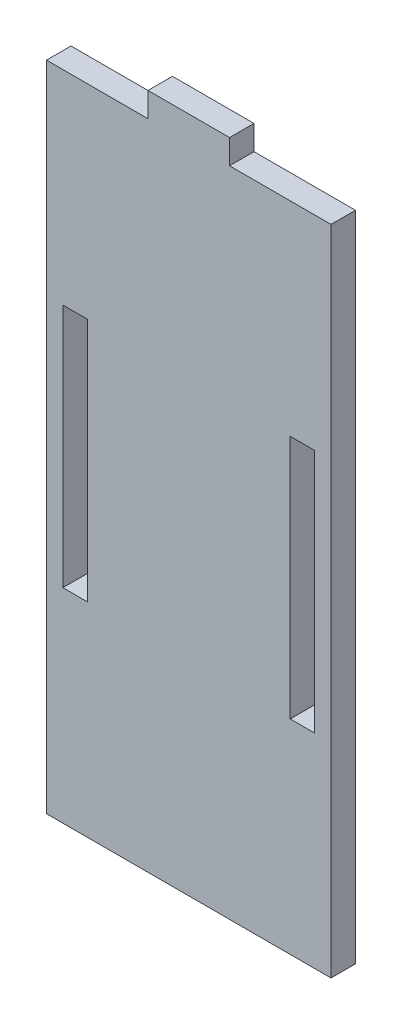
ISO-10303-21;
HEADER;
FILE_DESCRIPTION(('STEP AP214'),'2;1');
FILE_NAME('part.step','',(''),(''),'','','');
FILE_SCHEMA(('AUTOMOTIVE_DESIGN { 1 0 10303 214 1 1 1 1 }'));
ENDSEC;
DATA;
#1=APPLICATION_CONTEXT('core data for automotive mechanical design processes');
#2=APPLICATION_PROTOCOL_DEFINITION('international standard','automotive_design',2000,#1);
#3=PRODUCT_CONTEXT('',#1,'mechanical');
#4=PRODUCT('Part','Part','',(#3));
#5=PRODUCT_RELATED_PRODUCT_CATEGORY('part','',(#4));
#6=PRODUCT_DEFINITION_FORMATION('','',#4);
#7=PRODUCT_DEFINITION_CONTEXT('part definition',#1,'design');
#8=PRODUCT_DEFINITION('design','',#6,#7);
#9=PRODUCT_DEFINITION_SHAPE('','',#8);
#10=(LENGTH_UNIT() NAMED_UNIT(*) SI_UNIT(.MILLI.,.METRE.));
#11=(NAMED_UNIT(*) PLANE_ANGLE_UNIT() SI_UNIT($,.RADIAN.));
#12=(NAMED_UNIT(*) SI_UNIT($,.STERADIAN.) SOLID_ANGLE_UNIT());
#13=UNCERTAINTY_MEASURE_WITH_UNIT(LENGTH_MEASURE(1.E-05),#10,'distance_accuracy_value','');
#14=(GEOMETRIC_REPRESENTATION_CONTEXT(3) GLOBAL_UNCERTAINTY_ASSIGNED_CONTEXT((#13)) GLOBAL_UNIT_ASSIGNED_CONTEXT((#10,
#11,#12)) REPRESENTATION_CONTEXT('',''));
#15=CARTESIAN_POINT('',(0.,0.,0.));
#16=DIRECTION('',(0.,0.,1.));
#17=DIRECTION('',(1.,0.,0.));
#18=AXIS2_PLACEMENT_3D('',#15,#16,#17);
#19=CARTESIAN_POINT('',(0.,-25.,3.));
#20=DIRECTION('',(0.,1.,0.));
#21=DIRECTION('',(0.,0.,1.));
#22=AXIS2_PLACEMENT_3D('',#19,#20,#21);
#23=PLANE('',#22);
#24=DIRECTION('',(1.,0.,0.));
#25=VECTOR('',#24,1.);
#26=CARTESIAN_POINT('',(0.,-25.,0.));
#27=LINE('',#26,#25);
#28=CARTESIAN_POINT('',(2.,-25.,0.));
#29=VERTEX_POINT('',#28);
#30=CARTESIAN_POINT('',(5.,-25.,0.));
#31=VERTEX_POINT('',#30);
#32=EDGE_CURVE('E243',#29,#31,#27,.T.);
#33=ORIENTED_EDGE('',*,*,#32,.T.);
#34=DIRECTION('',(0.,0.,-1.));
#35=VECTOR('',#34,1.);
#36=CARTESIAN_POINT('',(5.,-25.,3.));
#37=LINE('',#36,#35);
#38=CARTESIAN_POINT('',(5.,-25.,3.));
#39=VERTEX_POINT('',#38);
#40=EDGE_CURVE('E11',#39,#31,#37,.T.);
#41=ORIENTED_EDGE('',*,*,#40,.F.);
#42=DIRECTION('',(1.,0.,0.));
#43=VECTOR('',#42,1.);
#44=CARTESIAN_POINT('',(0.,-25.,3.));
#45=LINE('',#44,#43);
#46=CARTESIAN_POINT('',(2.,-25.,3.));
#47=VERTEX_POINT('',#46);
#48=EDGE_CURVE('E176',#47,#39,#45,.T.);
#49=ORIENTED_EDGE('',*,*,#48,.F.);
#50=DIRECTION('',(0.,0.,-1.));
#51=VECTOR('',#50,1.);
#52=CARTESIAN_POINT('',(2.,-25.,3.));
#53=LINE('',#52,#51);
#54=EDGE_CURVE('E67',#47,#29,#53,.T.);
#55=ORIENTED_EDGE('',*,*,#54,.T.);
#56=EDGE_LOOP('',(#33,#41,#49,#55));
#57=FACE_BOUND('',#56,.T.);
#58=ADVANCED_FACE('F47',(#57),#23,.F.);
#59=CARTESIAN_POINT('',(5.,0.,3.));
#60=DIRECTION('',(1.,0.,0.));
#61=DIRECTION('',(0.,1.,0.));
#62=AXIS2_PLACEMENT_3D('',#59,#60,#61);
#63=PLANE('',#62);
#64=DIRECTION('',(0.,-1.,0.));
#65=VECTOR('',#64,1.);
#66=CARTESIAN_POINT('',(5.,0.,0.));
#67=LINE('',#66,#65);
#68=CARTESIAN_POINT('',(5.00000000000001,-55.,0.));
#69=VERTEX_POINT('',#68);
#70=EDGE_CURVE('E183',#31,#69,#67,.T.);
#71=ORIENTED_EDGE('',*,*,#70,.T.);
#72=DIRECTION('',(0.,0.,-1.));
#73=VECTOR('',#72,1.);
#74=CARTESIAN_POINT('',(5.00000000000001,-55.,3.));
#75=LINE('',#74,#73);
#76=CARTESIAN_POINT('',(5.00000000000001,-55.,3.));
#77=VERTEX_POINT('',#76);
#78=EDGE_CURVE('E58',#77,#69,#75,.T.);
#79=ORIENTED_EDGE('',*,*,#78,.F.);
#80=DIRECTION('',(0.,-1.,0.));
#81=VECTOR('',#80,1.);
#82=CARTESIAN_POINT('',(5.,0.,3.));
#83=LINE('',#82,#81);
#84=EDGE_CURVE('E170',#39,#77,#83,.T.);
#85=ORIENTED_EDGE('',*,*,#84,.F.);
#86=ORIENTED_EDGE('',*,*,#40,.T.);
#87=EDGE_LOOP('',(#71,#79,#85,#86));
#88=FACE_BOUND('',#87,.T.);
#89=ADVANCED_FACE('F182',(#88),#63,.F.);
#90=CARTESIAN_POINT('',(0.,-55.,3.));
#91=DIRECTION('',(0.,1.,0.));
#92=DIRECTION('',(0.,0.,1.));
#93=AXIS2_PLACEMENT_3D('',#90,#91,#92);
#94=PLANE('',#93);
#95=DIRECTION('',(1.,0.,0.));
#96=VECTOR('',#95,1.);
#97=CARTESIAN_POINT('',(0.,-55.,0.));
#98=LINE('',#97,#96);
#99=CARTESIAN_POINT('',(2.00000000000001,-55.,0.));
#100=VERTEX_POINT('',#99);
#101=EDGE_CURVE('E248',#100,#69,#98,.T.);
#102=ORIENTED_EDGE('',*,*,#101,.F.);
#103=DIRECTION('',(0.,0.,-1.));
#104=VECTOR('',#103,1.);
#105=CARTESIAN_POINT('',(2.00000000000001,-55.,3.));
#106=LINE('',#105,#104);
#107=CARTESIAN_POINT('',(2.00000000000001,-55.,3.));
#108=VERTEX_POINT('',#107);
#109=EDGE_CURVE('E117',#108,#100,#106,.T.);
#110=ORIENTED_EDGE('',*,*,#109,.F.);
#111=DIRECTION('',(1.,0.,0.));
#112=VECTOR('',#111,1.);
#113=CARTESIAN_POINT('',(0.,-55.,3.));
#114=LINE('',#113,#112);
#115=EDGE_CURVE('E175',#108,#77,#114,.T.);
#116=ORIENTED_EDGE('',*,*,#115,.T.);
#117=ORIENTED_EDGE('',*,*,#78,.T.);
#118=EDGE_LOOP('',(#102,#110,#116,#117));
#119=FACE_BOUND('',#118,.T.);
#120=ADVANCED_FACE('F188',(#119),#94,.T.);
#121=CARTESIAN_POINT('',(0.,-55.,3.));
#122=DIRECTION('',(0.,-1.,0.));
#123=DIRECTION('',(0.,0.,-1.));
#124=AXIS2_PLACEMENT_3D('',#121,#122,#123);
#125=PLANE('',#124);
#126=DIRECTION('',(-1.,0.,0.));
#127=VECTOR('',#126,1.);
#128=CARTESIAN_POINT('',(0.,-55.,0.));
#129=LINE('',#128,#127);
#130=CARTESIAN_POINT('',(32.87,-55.,0.));
#131=VERTEX_POINT('',#130);
#132=CARTESIAN_POINT('',(29.87,-55.,0.));
#133=VERTEX_POINT('',#132);
#134=EDGE_CURVE('E228',#131,#133,#129,.T.);
#135=ORIENTED_EDGE('',*,*,#134,.T.);
#136=DIRECTION('',(0.,0.,-1.));
#137=VECTOR('',#136,1.);
#138=CARTESIAN_POINT('',(29.87,-55.,3.));
#139=LINE('',#138,#137);
#140=CARTESIAN_POINT('',(29.87,-55.,3.));
#141=VERTEX_POINT('',#140);
#142=EDGE_CURVE('E257',#141,#133,#139,.T.);
#143=ORIENTED_EDGE('',*,*,#142,.F.);
#144=DIRECTION('',(-1.,0.,0.));
#145=VECTOR('',#144,1.);
#146=CARTESIAN_POINT('',(0.,-55.,3.));
#147=LINE('',#146,#145);
#148=CARTESIAN_POINT('',(32.87,-55.,3.));
#149=VERTEX_POINT('',#148);
#150=EDGE_CURVE('E341',#149,#141,#147,.T.);
#151=ORIENTED_EDGE('',*,*,#150,.F.);
#152=DIRECTION('',(0.,0.,-1.));
#153=VECTOR('',#152,1.);
#154=CARTESIAN_POINT('',(32.87,-55.,3.));
#155=LINE('',#154,#153);
#156=EDGE_CURVE('E260',#149,#131,#155,.T.);
#157=ORIENTED_EDGE('',*,*,#156,.T.);
#158=EDGE_LOOP('',(#135,#143,#151,#157));
#159=FACE_BOUND('',#158,.T.);
#160=ADVANCED_FACE('F366',(#159),#125,.F.);
#161=CARTESIAN_POINT('',(29.87,0.,3.));
#162=DIRECTION('',(1.,0.,0.));
#163=DIRECTION('',(0.,0.,-1.));
#164=AXIS2_PLACEMENT_3D('',#161,#162,#163);
#165=PLANE('',#164);
#166=DIRECTION('',(0.,-1.,0.));
#167=VECTOR('',#166,1.);
#168=CARTESIAN_POINT('',(29.87,0.,0.));
#169=LINE('',#168,#167);
#170=CARTESIAN_POINT('',(29.87,-25.,0.));
#171=VERTEX_POINT('',#170);
#172=EDGE_CURVE('E232',#171,#133,#169,.T.);
#173=ORIENTED_EDGE('',*,*,#172,.F.);
#174=DIRECTION('',(0.,0.,-1.));
#175=VECTOR('',#174,1.);
#176=CARTESIAN_POINT('',(29.87,-25.,3.));
#177=LINE('',#176,#175);
#178=CARTESIAN_POINT('',(29.87,-25.,3.));
#179=VERTEX_POINT('',#178);
#180=EDGE_CURVE('E267',#179,#171,#177,.T.);
#181=ORIENTED_EDGE('',*,*,#180,.F.);
#182=DIRECTION('',(0.,-1.,0.));
#183=VECTOR('',#182,1.);
#184=CARTESIAN_POINT('',(29.87,0.,3.));
#185=LINE('',#184,#183);
#186=EDGE_CURVE('E344',#179,#141,#185,.T.);
#187=ORIENTED_EDGE('',*,*,#186,.T.);
#188=ORIENTED_EDGE('',*,*,#142,.T.);
#189=EDGE_LOOP('',(#173,#181,#187,#188));
#190=FACE_BOUND('',#189,.T.);
#191=ADVANCED_FACE('F369',(#190),#165,.T.);
#192=CARTESIAN_POINT('',(0.,-25.,3.));
#193=DIRECTION('',(0.,-1.,0.));
#194=DIRECTION('',(0.,0.,-1.));
#195=AXIS2_PLACEMENT_3D('',#192,#193,#194);
#196=PLANE('',#195);
#197=DIRECTION('',(-1.,0.,0.));
#198=VECTOR('',#197,1.);
#199=CARTESIAN_POINT('',(0.,-25.,0.));
#200=LINE('',#199,#198);
#201=CARTESIAN_POINT('',(32.87,-25.,0.));
#202=VERTEX_POINT('',#201);
#203=EDGE_CURVE('E236',#202,#171,#200,.T.);
#204=ORIENTED_EDGE('',*,*,#203,.F.);
#205=DIRECTION('',(0.,0.,-1.));
#206=VECTOR('',#205,1.);
#207=CARTESIAN_POINT('',(32.87,-25.,3.));
#208=LINE('',#207,#206);
#209=CARTESIAN_POINT('',(32.87,-25.,3.));
#210=VERTEX_POINT('',#209);
#211=EDGE_CURVE('E264',#210,#202,#208,.T.);
#212=ORIENTED_EDGE('',*,*,#211,.F.);
#213=DIRECTION('',(-1.,0.,0.));
#214=VECTOR('',#213,1.);
#215=CARTESIAN_POINT('',(0.,-25.,3.));
#216=LINE('',#215,#214);
#217=EDGE_CURVE('E348',#210,#179,#216,.T.);
#218=ORIENTED_EDGE('',*,*,#217,.T.);
#219=ORIENTED_EDGE('',*,*,#180,.T.);
#220=EDGE_LOOP('',(#204,#212,#218,#219));
#221=FACE_BOUND('',#220,.T.);
#222=ADVANCED_FACE('F372',(#221),#196,.T.);
#223=CARTESIAN_POINT('',(0.,-80.,3.));
#224=DIRECTION('',(0.,1.,0.));
#225=DIRECTION('',(0.,0.,1.));
#226=AXIS2_PLACEMENT_3D('',#223,#224,#225);
#227=PLANE('',#226);
#228=DIRECTION('',(1.,0.,0.));
#229=VECTOR('',#228,1.);
#230=CARTESIAN_POINT('',(0.,-80.,0.));
#231=LINE('',#230,#229);
#232=CARTESIAN_POINT('',(0.,-80.,0.));
#233=VERTEX_POINT('',#232);
#234=CARTESIAN_POINT('',(34.87,-80.,0.));
#235=VERTEX_POINT('',#234);
#236=EDGE_CURVE('E197',#233,#235,#231,.T.);
#237=ORIENTED_EDGE('',*,*,#236,.T.);
#238=DIRECTION('',(0.,0.,-1.));
#239=VECTOR('',#238,1.);
#240=CARTESIAN_POINT('',(34.87,-80.,3.));
#241=LINE('',#240,#239);
#242=CARTESIAN_POINT('',(34.87,-80.,3.));
#243=VERTEX_POINT('',#242);
#244=EDGE_CURVE('E51',#243,#235,#241,.T.);
#245=ORIENTED_EDGE('',*,*,#244,.F.);
#246=DIRECTION('',(1.,0.,0.));
#247=VECTOR('',#246,1.);
#248=CARTESIAN_POINT('',(0.,-80.,3.));
#249=LINE('',#248,#247);
#250=CARTESIAN_POINT('',(0.,-80.,3.));
#251=VERTEX_POINT('',#250);
#252=EDGE_CURVE('E130',#251,#243,#249,.T.);
#253=ORIENTED_EDGE('',*,*,#252,.F.);
#254=DIRECTION('',(0.,0.,-1.));
#255=VECTOR('',#254,1.);
#256=CARTESIAN_POINT('',(0.,-80.,3.));
#257=LINE('',#256,#255);
#258=EDGE_CURVE('E193',#251,#233,#257,.T.);
#259=ORIENTED_EDGE('',*,*,#258,.T.);
#260=EDGE_LOOP('',(#237,#245,#253,#259));
#261=FACE_BOUND('',#260,.T.);
#262=ADVANCED_FACE('F49',(#261),#227,.F.);
#263=CARTESIAN_POINT('',(34.87,0.,3.));
#264=DIRECTION('',(1.,0.,0.));
#265=DIRECTION('',(0.,0.,-1.));
#266=AXIS2_PLACEMENT_3D('',#263,#264,#265);
#267=PLANE('',#266);
#268=DIRECTION('',(0.,-1.,0.));
#269=VECTOR('',#268,1.);
#270=CARTESIAN_POINT('',(34.87,0.,0.));
#271=LINE('',#270,#269);
#272=CARTESIAN_POINT('',(34.87,0.,0.));
#273=VERTEX_POINT('',#272);
#274=EDGE_CURVE('E201',#273,#235,#271,.T.);
#275=ORIENTED_EDGE('',*,*,#274,.F.);
#276=DIRECTION('',(0.,0.,-1.));
#277=VECTOR('',#276,1.);
#278=CARTESIAN_POINT('',(34.87,0.,3.));
#279=LINE('',#278,#277);
#280=CARTESIAN_POINT('',(34.87,0.,3.));
#281=VERTEX_POINT('',#280);
#282=EDGE_CURVE('E289',#281,#273,#279,.T.);
#283=ORIENTED_EDGE('',*,*,#282,.F.);
#284=DIRECTION('',(0.,-1.,0.));
#285=VECTOR('',#284,1.);
#286=CARTESIAN_POINT('',(34.87,0.,3.));
#287=LINE('',#286,#285);
#288=EDGE_CURVE('E299',#281,#243,#287,.T.);
#289=ORIENTED_EDGE('',*,*,#288,.T.);
#290=ORIENTED_EDGE('',*,*,#244,.T.);
#291=EDGE_LOOP('',(#275,#283,#289,#290));
#292=FACE_BOUND('',#291,.T.);
#293=ADVANCED_FACE('F298',(#292),#267,.T.);
#294=CARTESIAN_POINT('',(0.,0.,3.));
#295=DIRECTION('',(0.,1.,0.));
#296=DIRECTION('',(-1.,0.,0.));
#297=AXIS2_PLACEMENT_3D('',#294,#295,#296);
#298=PLANE('',#297);
#299=DIRECTION('',(1.,0.,0.));
#300=VECTOR('',#299,1.);
#301=CARTESIAN_POINT('',(0.,0.,0.));
#302=LINE('',#301,#300);
#303=CARTESIAN_POINT('',(22.435,0.,0.));
#304=VERTEX_POINT('',#303);
#305=EDGE_CURVE('E205',#304,#273,#302,.T.);
#306=ORIENTED_EDGE('',*,*,#305,.F.);
#307=DIRECTION('',(0.,0.,-1.));
#308=VECTOR('',#307,1.);
#309=CARTESIAN_POINT('',(22.435,0.,3.));
#310=LINE('',#309,#308);
#311=CARTESIAN_POINT('',(22.435,0.,3.));
#312=VERTEX_POINT('',#311);
#313=EDGE_CURVE('E287',#312,#304,#310,.T.);
#314=ORIENTED_EDGE('',*,*,#313,.F.);
#315=DIRECTION('',(1.,0.,0.));
#316=VECTOR('',#315,1.);
#317=CARTESIAN_POINT('',(0.,0.,3.));
#318=LINE('',#317,#316);
#319=EDGE_CURVE('E311',#312,#281,#318,.T.);
#320=ORIENTED_EDGE('',*,*,#319,.T.);
#321=ORIENTED_EDGE('',*,*,#282,.T.);
#322=EDGE_LOOP('',(#306,#314,#320,#321));
#323=FACE_BOUND('',#322,.T.);
#324=ADVANCED_FACE('F308',(#323),#298,.T.);
#325=CARTESIAN_POINT('',(22.435,0.,3.));
#326=DIRECTION('',(-1.,0.,0.));
#327=DIRECTION('',(0.,0.,1.));
#328=AXIS2_PLACEMENT_3D('',#325,#326,#327);
#329=PLANE('',#328);
#330=DIRECTION('',(0.,1.,0.));
#331=VECTOR('',#330,1.);
#332=CARTESIAN_POINT('',(22.435,0.,0.));
#333=LINE('',#332,#331);
#334=CARTESIAN_POINT('',(22.435,3.,0.));
#335=VERTEX_POINT('',#334);
#336=EDGE_CURVE('E209',#304,#335,#333,.T.);
#337=ORIENTED_EDGE('',*,*,#336,.T.);
#338=DIRECTION('',(0.,0.,-1.));
#339=VECTOR('',#338,1.);
#340=CARTESIAN_POINT('',(22.435,3.,3.));
#341=LINE('',#340,#339);
#342=CARTESIAN_POINT('',(22.435,3.,3.));
#343=VERTEX_POINT('',#342);
#344=EDGE_CURVE('E284',#343,#335,#341,.T.);
#345=ORIENTED_EDGE('',*,*,#344,.F.);
#346=DIRECTION('',(0.,1.,0.));
#347=VECTOR('',#346,1.);
#348=CARTESIAN_POINT('',(22.435,0.,3.));
#349=LINE('',#348,#347);
#350=EDGE_CURVE('E314',#312,#343,#349,.T.);
#351=ORIENTED_EDGE('',*,*,#350,.F.);
#352=ORIENTED_EDGE('',*,*,#313,.T.);
#353=EDGE_LOOP('',(#337,#345,#351,#352));
#354=FACE_BOUND('',#353,.T.);
#355=ADVANCED_FACE('F315',(#354),#329,.F.);
#356=CARTESIAN_POINT('',(0.,3.,3.));
#357=DIRECTION('',(0.,1.,0.));
#358=DIRECTION('',(0.,0.,1.));
#359=AXIS2_PLACEMENT_3D('',#356,#357,#358);
#360=PLANE('',#359);
#361=DIRECTION('',(1.,0.,0.));
#362=VECTOR('',#361,1.);
#363=CARTESIAN_POINT('',(0.,3.,0.));
#364=LINE('',#363,#362);
#365=CARTESIAN_POINT('',(12.435,3.,0.));
#366=VERTEX_POINT('',#365);
#367=EDGE_CURVE('E213',#366,#335,#364,.T.);
#368=ORIENTED_EDGE('',*,*,#367,.F.);
#369=DIRECTION('',(0.,0.,-1.));
#370=VECTOR('',#369,1.);
#371=CARTESIAN_POINT('',(12.435,3.,3.));
#372=LINE('',#371,#370);
#373=CARTESIAN_POINT('',(12.435,3.,3.));
#374=VERTEX_POINT('',#373);
#375=EDGE_CURVE('E281',#374,#366,#372,.T.);
#376=ORIENTED_EDGE('',*,*,#375,.F.);
#377=DIRECTION('',(1.,0.,0.));
#378=VECTOR('',#377,1.);
#379=CARTESIAN_POINT('',(0.,3.,3.));
#380=LINE('',#379,#378);
#381=EDGE_CURVE('E319',#374,#343,#380,.T.);
#382=ORIENTED_EDGE('',*,*,#381,.T.);
#383=ORIENTED_EDGE('',*,*,#344,.T.);
#384=EDGE_LOOP('',(#368,#376,#382,#383));
#385=FACE_BOUND('',#384,.T.);
#386=ADVANCED_FACE('F410',(#385),#360,.T.);
#387=CARTESIAN_POINT('',(12.435,0.,3.));
#388=DIRECTION('',(-1.,0.,0.));
#389=DIRECTION('',(0.,-1.,0.));
#390=AXIS2_PLACEMENT_3D('',#387,#388,#389);
#391=PLANE('',#390);
#392=DIRECTION('',(0.,1.,0.));
#393=VECTOR('',#392,1.);
#394=CARTESIAN_POINT('',(12.435,0.,0.));
#395=LINE('',#394,#393);
#396=CARTESIAN_POINT('',(12.435,0.,0.));
#397=VERTEX_POINT('',#396);
#398=EDGE_CURVE('E217',#397,#366,#395,.T.);
#399=ORIENTED_EDGE('',*,*,#398,.F.);
#400=DIRECTION('',(0.,0.,-1.));
#401=VECTOR('',#400,1.);
#402=CARTESIAN_POINT('',(12.435,0.,3.));
#403=LINE('',#402,#401);
#404=CARTESIAN_POINT('',(12.435,0.,3.));
#405=VERTEX_POINT('',#404);
#406=EDGE_CURVE('E278',#405,#397,#403,.T.);
#407=ORIENTED_EDGE('',*,*,#406,.F.);
#408=DIRECTION('',(0.,1.,0.));
#409=VECTOR('',#408,1.);
#410=CARTESIAN_POINT('',(12.435,0.,3.));
#411=LINE('',#410,#409);
#412=EDGE_CURVE('E330',#405,#374,#411,.T.);
#413=ORIENTED_EDGE('',*,*,#412,.T.);
#414=ORIENTED_EDGE('',*,*,#375,.T.);
#415=EDGE_LOOP('',(#399,#407,#413,#414));
#416=FACE_BOUND('',#415,.T.);
#417=ADVANCED_FACE('F406',(#416),#391,.T.);
#418=CARTESIAN_POINT('',(0.,0.,3.));
#419=DIRECTION('',(0.,1.,0.));
#420=DIRECTION('',(-1.,0.,0.));
#421=AXIS2_PLACEMENT_3D('',#418,#419,#420);
#422=PLANE('',#421);
#423=DIRECTION('',(1.,0.,0.));
#424=VECTOR('',#423,1.);
#425=CARTESIAN_POINT('',(0.,0.,0.));
#426=LINE('',#425,#424);
#427=CARTESIAN_POINT('',(0.,0.,0.));
#428=VERTEX_POINT('',#427);
#429=EDGE_CURVE('E221',#428,#397,#426,.T.);
#430=ORIENTED_EDGE('',*,*,#429,.F.);
#431=DIRECTION('',(0.,0.,-1.));
#432=VECTOR('',#431,1.);
#433=CARTESIAN_POINT('',(0.,0.,3.));
#434=LINE('',#433,#432);
#435=CARTESIAN_POINT('',(0.,0.,3.));
#436=VERTEX_POINT('',#435);
#437=EDGE_CURVE('E275',#436,#428,#434,.T.);
#438=ORIENTED_EDGE('',*,*,#437,.F.);
#439=DIRECTION('',(1.,0.,0.));
#440=VECTOR('',#439,1.);
#441=CARTESIAN_POINT('',(0.,0.,3.));
#442=LINE('',#441,#440);
#443=EDGE_CURVE('E334',#436,#405,#442,.T.);
#444=ORIENTED_EDGE('',*,*,#443,.T.);
#445=ORIENTED_EDGE('',*,*,#406,.T.);
#446=EDGE_LOOP('',(#430,#438,#444,#445));
#447=FACE_BOUND('',#446,.T.);
#448=ADVANCED_FACE('F397',(#447),#422,.T.);
#449=CARTESIAN_POINT('',(32.87,0.,3.));
#450=DIRECTION('',(1.,0.,0.));
#451=DIRECTION('',(0.,1.,0.));
#452=AXIS2_PLACEMENT_3D('',#449,#450,#451);
#453=PLANE('',#452);
#454=DIRECTION('',(0.,-1.,0.));
#455=VECTOR('',#454,1.);
#456=CARTESIAN_POINT('',(32.87,0.,0.));
#457=LINE('',#456,#455);
#458=EDGE_CURVE('E240',#202,#131,#457,.T.);
#459=ORIENTED_EDGE('',*,*,#458,.T.);
#460=ORIENTED_EDGE('',*,*,#156,.F.);
#461=DIRECTION('',(0.,-1.,0.));
#462=VECTOR('',#461,1.);
#463=CARTESIAN_POINT('',(32.87,0.,3.));
#464=LINE('',#463,#462);
#465=EDGE_CURVE('E352',#210,#149,#464,.T.);
#466=ORIENTED_EDGE('',*,*,#465,.F.);
#467=ORIENTED_EDGE('',*,*,#211,.T.);
#468=EDGE_LOOP('',(#459,#460,#466,#467));
#469=FACE_BOUND('',#468,.T.);
#470=ADVANCED_FACE('F362',(#469),#453,.F.);
#471=CARTESIAN_POINT('',(0.,0.,3.));
#472=DIRECTION('',(1.,0.,0.));
#473=DIRECTION('',(0.,1.,0.));
#474=AXIS2_PLACEMENT_3D('',#471,#472,#473);
#475=PLANE('',#474);
#476=DIRECTION('',(0.,-1.,0.));
#477=VECTOR('',#476,1.);
#478=CARTESIAN_POINT('',(0.,0.,0.));
#479=LINE('',#478,#477);
#480=EDGE_CURVE('E225',#428,#233,#479,.T.);
#481=ORIENTED_EDGE('',*,*,#480,.T.);
#482=ORIENTED_EDGE('',*,*,#258,.F.);
#483=DIRECTION('',(0.,-1.,0.));
#484=VECTOR('',#483,1.);
#485=CARTESIAN_POINT('',(0.,0.,3.));
#486=LINE('',#485,#484);
#487=EDGE_CURVE('E338',#436,#251,#486,.T.);
#488=ORIENTED_EDGE('',*,*,#487,.F.);
#489=ORIENTED_EDGE('',*,*,#437,.T.);
#490=EDGE_LOOP('',(#481,#482,#488,#489));
#491=FACE_BOUND('',#490,.T.);
#492=ADVANCED_FACE('F378',(#491),#475,.F.);
#493=CARTESIAN_POINT('',(2.,0.,3.));
#494=DIRECTION('',(1.,0.,0.));
#495=DIRECTION('',(0.,1.,0.));
#496=AXIS2_PLACEMENT_3D('',#493,#494,#495);
#497=PLANE('',#496);
#498=DIRECTION('',(0.,-1.,0.));
#499=VECTOR('',#498,1.);
#500=CARTESIAN_POINT('',(2.,0.,0.));
#501=LINE('',#500,#499);
#502=EDGE_CURVE('E251',#29,#100,#501,.T.);
#503=ORIENTED_EDGE('',*,*,#502,.F.);
#504=ORIENTED_EDGE('',*,*,#54,.F.);
#505=DIRECTION('',(0.,-1.,0.));
#506=VECTOR('',#505,1.);
#507=CARTESIAN_POINT('',(2.,0.,3.));
#508=LINE('',#507,#506);
#509=EDGE_CURVE('E190',#47,#108,#508,.T.);
#510=ORIENTED_EDGE('',*,*,#509,.T.);
#511=ORIENTED_EDGE('',*,*,#109,.T.);
#512=EDGE_LOOP('',(#503,#504,#510,#511));
#513=FACE_BOUND('',#512,.T.);
#514=ADVANCED_FACE('F376',(#513),#497,.T.);
#515=CARTESIAN_POINT('',(0.,0.,3.));
#516=DIRECTION('',(0.,0.,1.));
#517=DIRECTION('',(1.,0.,0.));
#518=AXIS2_PLACEMENT_3D('',#515,#516,#517);
#519=PLANE('',#518);
#520=ORIENTED_EDGE('',*,*,#252,.T.);
#521=ORIENTED_EDGE('',*,*,#288,.F.);
#522=ORIENTED_EDGE('',*,*,#319,.F.);
#523=ORIENTED_EDGE('',*,*,#350,.T.);
#524=ORIENTED_EDGE('',*,*,#381,.F.);
#525=ORIENTED_EDGE('',*,*,#412,.F.);
#526=ORIENTED_EDGE('',*,*,#443,.F.);
#527=ORIENTED_EDGE('',*,*,#487,.T.);
#528=EDGE_LOOP('',(#520,#521,#522,#523,#524,#525,#526,#527));
#529=FACE_BOUND('',#528,.T.);
#530=ORIENTED_EDGE('',*,*,#150,.T.);
#531=ORIENTED_EDGE('',*,*,#186,.F.);
#532=ORIENTED_EDGE('',*,*,#217,.F.);
#533=ORIENTED_EDGE('',*,*,#465,.T.);
#534=EDGE_LOOP('',(#530,#531,#532,#533));
#535=FACE_BOUND('',#534,.T.);
#536=ORIENTED_EDGE('',*,*,#48,.T.);
#537=ORIENTED_EDGE('',*,*,#84,.T.);
#538=ORIENTED_EDGE('',*,*,#115,.F.);
#539=ORIENTED_EDGE('',*,*,#509,.F.);
#540=EDGE_LOOP('',(#536,#537,#538,#539));
#541=FACE_BOUND('',#540,.T.);
#542=ADVANCED_FACE('F172',(#529,#535,#541),#519,.T.);
#543=CARTESIAN_POINT('',(0.,0.,0.));
#544=DIRECTION('',(0.,0.,1.));
#545=DIRECTION('',(1.,0.,0.));
#546=AXIS2_PLACEMENT_3D('',#543,#544,#545);
#547=PLANE('',#546);
#548=ORIENTED_EDGE('',*,*,#236,.F.);
#549=ORIENTED_EDGE('',*,*,#480,.F.);
#550=ORIENTED_EDGE('',*,*,#429,.T.);
#551=ORIENTED_EDGE('',*,*,#398,.T.);
#552=ORIENTED_EDGE('',*,*,#367,.T.);
#553=ORIENTED_EDGE('',*,*,#336,.F.);
#554=ORIENTED_EDGE('',*,*,#305,.T.);
#555=ORIENTED_EDGE('',*,*,#274,.T.);
#556=EDGE_LOOP('',(#548,#549,#550,#551,#552,#553,#554,#555));
#557=FACE_BOUND('',#556,.T.);
#558=ORIENTED_EDGE('',*,*,#134,.F.);
#559=ORIENTED_EDGE('',*,*,#458,.F.);
#560=ORIENTED_EDGE('',*,*,#203,.T.);
#561=ORIENTED_EDGE('',*,*,#172,.T.);
#562=EDGE_LOOP('',(#558,#559,#560,#561));
#563=FACE_BOUND('',#562,.T.);
#564=ORIENTED_EDGE('',*,*,#32,.F.);
#565=ORIENTED_EDGE('',*,*,#502,.T.);
#566=ORIENTED_EDGE('',*,*,#101,.T.);
#567=ORIENTED_EDGE('',*,*,#70,.F.);
#568=EDGE_LOOP('',(#564,#565,#566,#567));
#569=FACE_BOUND('',#568,.T.);
#570=ADVANCED_FACE('F305',(#557,#563,#569),#547,.F.);
#571=CLOSED_SHELL('',(#58,#89,#120,#160,#191,#222,#262,#293,#324,#355,#386,#417,#448,#470,#492,
#514,#542,#570));
#572=MANIFOLD_SOLID_BREP('B2',#571);
#573=ADVANCED_BREP_SHAPE_REPRESENTATION('',(#18,#572),#14);
#574=SHAPE_DEFINITION_REPRESENTATION(#9,#573);
ENDSEC;
END-ISO-10303-21;
